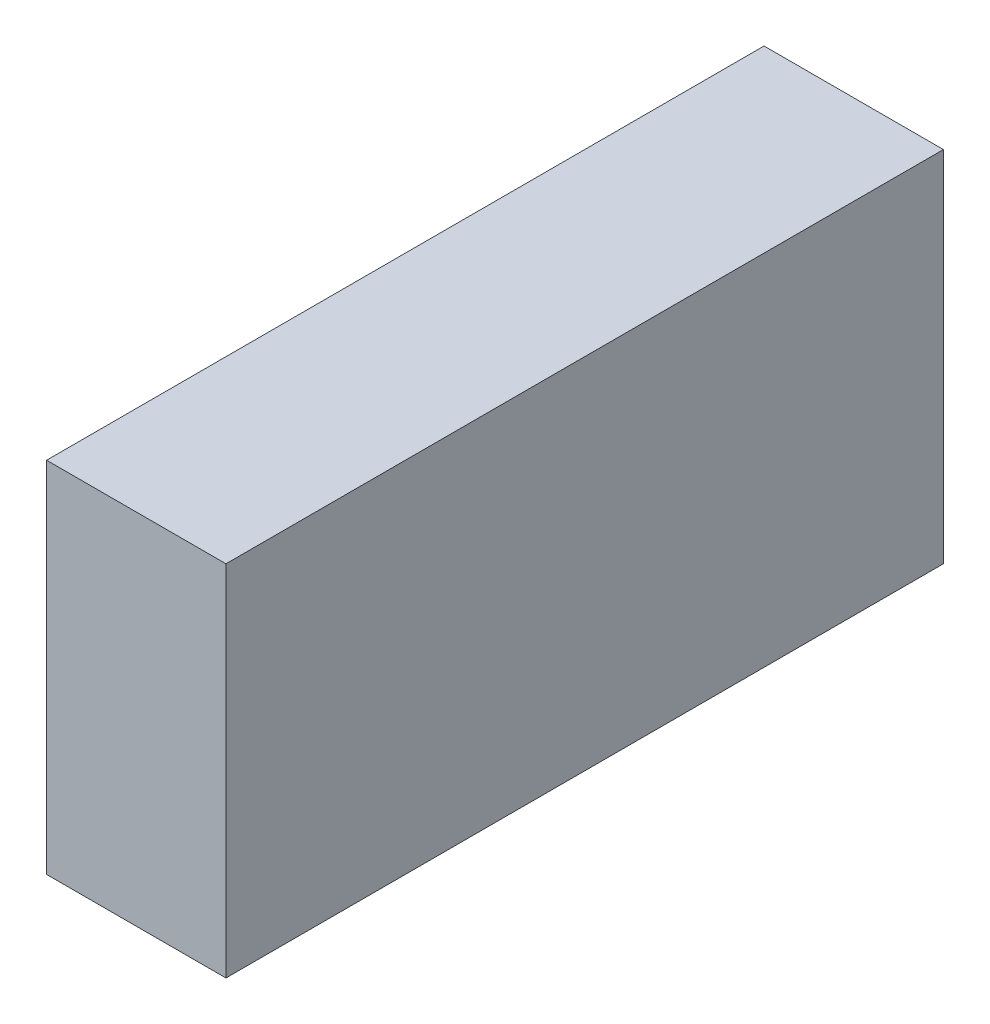
ISO-10303-21;
HEADER;
FILE_DESCRIPTION(('STEP AP214'),'2;1');
FILE_NAME('part.step','',(''),(''),'','','');
FILE_SCHEMA(('AUTOMOTIVE_DESIGN { 1 0 10303 214 1 1 1 1 }'));
ENDSEC;
DATA;
#1=APPLICATION_CONTEXT('core data for automotive mechanical design processes');
#2=APPLICATION_PROTOCOL_DEFINITION('international standard','automotive_design',2000,#1);
#3=PRODUCT_CONTEXT('',#1,'mechanical');
#4=PRODUCT('Part','Part','',(#3));
#5=PRODUCT_RELATED_PRODUCT_CATEGORY('part','',(#4));
#6=PRODUCT_DEFINITION_FORMATION('','',#4);
#7=PRODUCT_DEFINITION_CONTEXT('part definition',#1,'design');
#8=PRODUCT_DEFINITION('design','',#6,#7);
#9=PRODUCT_DEFINITION_SHAPE('','',#8);
#10=(LENGTH_UNIT() NAMED_UNIT(*) SI_UNIT(.MILLI.,.METRE.));
#11=(NAMED_UNIT(*) PLANE_ANGLE_UNIT() SI_UNIT($,.RADIAN.));
#12=(NAMED_UNIT(*) SI_UNIT($,.STERADIAN.) SOLID_ANGLE_UNIT());
#13=UNCERTAINTY_MEASURE_WITH_UNIT(LENGTH_MEASURE(1.E-05),#10,'distance_accuracy_value','');
#14=(GEOMETRIC_REPRESENTATION_CONTEXT(3) GLOBAL_UNCERTAINTY_ASSIGNED_CONTEXT((#13)) GLOBAL_UNIT_ASSIGNED_CONTEXT((#10,
#11,#12)) REPRESENTATION_CONTEXT('',''));
#15=CARTESIAN_POINT('',(0.,0.,0.));
#16=DIRECTION('',(0.,0.,1.));
#17=DIRECTION('',(1.,0.,0.));
#18=AXIS2_PLACEMENT_3D('',#15,#16,#17);
#19=CARTESIAN_POINT('',(10.,20.,0.));
#20=DIRECTION('',(0.,0.,-1.));
#21=DIRECTION('',(-1.,0.,0.));
#22=AXIS2_PLACEMENT_3D('',#19,#20,#21);
#23=PLANE('',#22);
#24=DIRECTION('',(0.,-1.,0.));
#25=VECTOR('',#24,1.);
#26=CARTESIAN_POINT('',(0.,20.,0.));
#27=LINE('',#26,#25);
#28=CARTESIAN_POINT('',(0.,20.,0.));
#29=VERTEX_POINT('',#28);
#30=CARTESIAN_POINT('',(0.,0.,0.));
#31=VERTEX_POINT('',#30);
#32=EDGE_CURVE('E104',#29,#31,#27,.T.);
#33=ORIENTED_EDGE('',*,*,#32,.T.);
#34=DIRECTION('',(-1.,0.,0.));
#35=VECTOR('',#34,1.);
#36=CARTESIAN_POINT('',(10.,0.,0.));
#37=LINE('',#36,#35);
#38=CARTESIAN_POINT('',(10.,0.,0.));
#39=VERTEX_POINT('',#38);
#40=EDGE_CURVE('E11',#39,#31,#37,.T.);
#41=ORIENTED_EDGE('',*,*,#40,.F.);
#42=DIRECTION('',(0.,-1.,0.));
#43=VECTOR('',#42,1.);
#44=CARTESIAN_POINT('',(10.,20.,0.));
#45=LINE('',#44,#43);
#46=CARTESIAN_POINT('',(10.,20.,0.));
#47=VERTEX_POINT('',#46);
#48=EDGE_CURVE('E92',#47,#39,#45,.T.);
#49=ORIENTED_EDGE('',*,*,#48,.F.);
#50=DIRECTION('',(-1.,0.,0.));
#51=VECTOR('',#50,1.);
#52=CARTESIAN_POINT('',(10.,20.,0.));
#53=LINE('',#52,#51);
#54=EDGE_CURVE('E100',#47,#29,#53,.T.);
#55=ORIENTED_EDGE('',*,*,#54,.T.);
#56=EDGE_LOOP('',(#33,#41,#49,#55));
#57=FACE_BOUND('',#56,.T.);
#58=ADVANCED_FACE('F41',(#57),#23,.F.);
#59=CARTESIAN_POINT('',(10.,0.,0.));
#60=DIRECTION('',(0.,1.,0.));
#61=DIRECTION('',(0.,0.,1.));
#62=AXIS2_PLACEMENT_3D('',#59,#60,#61);
#63=PLANE('',#62);
#64=DIRECTION('',(0.,0.,-1.));
#65=VECTOR('',#64,1.);
#66=CARTESIAN_POINT('',(0.,0.,0.));
#67=LINE('',#66,#65);
#68=CARTESIAN_POINT('',(0.,0.,-40.));
#69=VERTEX_POINT('',#68);
#70=EDGE_CURVE('E96',#31,#69,#67,.T.);
#71=ORIENTED_EDGE('',*,*,#70,.T.);
#72=DIRECTION('',(-1.,0.,0.));
#73=VECTOR('',#72,1.);
#74=CARTESIAN_POINT('',(10.,0.,-40.));
#75=LINE('',#74,#73);
#76=CARTESIAN_POINT('',(10.,0.,-40.));
#77=VERTEX_POINT('',#76);
#78=EDGE_CURVE('E49',#77,#69,#75,.T.);
#79=ORIENTED_EDGE('',*,*,#78,.F.);
#80=DIRECTION('',(0.,0.,-1.));
#81=VECTOR('',#80,1.);
#82=CARTESIAN_POINT('',(10.,0.,0.));
#83=LINE('',#82,#81);
#84=EDGE_CURVE('E87',#39,#77,#83,.T.);
#85=ORIENTED_EDGE('',*,*,#84,.F.);
#86=ORIENTED_EDGE('',*,*,#40,.T.);
#87=EDGE_LOOP('',(#71,#79,#85,#86));
#88=FACE_BOUND('',#87,.T.);
#89=ADVANCED_FACE('F95',(#88),#63,.F.);
#90=CARTESIAN_POINT('',(10.,0.,-40.));
#91=DIRECTION('',(0.,0.,1.));
#92=DIRECTION('',(1.,0.,0.));
#93=AXIS2_PLACEMENT_3D('',#90,#91,#92);
#94=PLANE('',#93);
#95=DIRECTION('',(0.,1.,0.));
#96=VECTOR('',#95,1.);
#97=CARTESIAN_POINT('',(0.,0.,-40.));
#98=LINE('',#97,#96);
#99=CARTESIAN_POINT('',(0.,20.,-40.));
#100=VERTEX_POINT('',#99);
#101=EDGE_CURVE('E74',#69,#100,#98,.T.);
#102=ORIENTED_EDGE('',*,*,#101,.T.);
#103=DIRECTION('',(-1.,0.,0.));
#104=VECTOR('',#103,1.);
#105=CARTESIAN_POINT('',(10.,20.,-40.));
#106=LINE('',#105,#104);
#107=CARTESIAN_POINT('',(10.,20.,-40.));
#108=VERTEX_POINT('',#107);
#109=EDGE_CURVE('E97',#108,#100,#106,.T.);
#110=ORIENTED_EDGE('',*,*,#109,.F.);
#111=DIRECTION('',(0.,1.,0.));
#112=VECTOR('',#111,1.);
#113=CARTESIAN_POINT('',(10.,0.,-40.));
#114=LINE('',#113,#112);
#115=EDGE_CURVE('E90',#77,#108,#114,.T.);
#116=ORIENTED_EDGE('',*,*,#115,.F.);
#117=ORIENTED_EDGE('',*,*,#78,.T.);
#118=EDGE_LOOP('',(#102,#110,#116,#117));
#119=FACE_BOUND('',#118,.T.);
#120=ADVANCED_FACE('F98',(#119),#94,.F.);
#121=CARTESIAN_POINT('',(10.,20.,-40.));
#122=DIRECTION('',(0.,-1.,0.));
#123=DIRECTION('',(0.,0.,-1.));
#124=AXIS2_PLACEMENT_3D('',#121,#122,#123);
#125=PLANE('',#124);
#126=DIRECTION('',(0.,0.,1.));
#127=VECTOR('',#126,1.);
#128=CARTESIAN_POINT('',(0.,20.,-40.));
#129=LINE('',#128,#127);
#130=EDGE_CURVE('E80',#100,#29,#129,.T.);
#131=ORIENTED_EDGE('',*,*,#130,.T.);
#132=ORIENTED_EDGE('',*,*,#54,.F.);
#133=DIRECTION('',(0.,0.,1.));
#134=VECTOR('',#133,1.);
#135=CARTESIAN_POINT('',(10.,20.,-40.));
#136=LINE('',#135,#134);
#137=EDGE_CURVE('E57',#108,#47,#136,.T.);
#138=ORIENTED_EDGE('',*,*,#137,.F.);
#139=ORIENTED_EDGE('',*,*,#109,.T.);
#140=EDGE_LOOP('',(#131,#132,#138,#139));
#141=FACE_BOUND('',#140,.T.);
#142=ADVANCED_FACE('F111',(#141),#125,.F.);
#143=CARTESIAN_POINT('',(10.,0.,0.));
#144=DIRECTION('',(1.,0.,0.));
#145=DIRECTION('',(0.,0.,-1.));
#146=AXIS2_PLACEMENT_3D('',#143,#144,#145);
#147=PLANE('',#146);
#148=ORIENTED_EDGE('',*,*,#48,.T.);
#149=ORIENTED_EDGE('',*,*,#84,.T.);
#150=ORIENTED_EDGE('',*,*,#115,.T.);
#151=ORIENTED_EDGE('',*,*,#137,.T.);
#152=EDGE_LOOP('',(#148,#149,#150,#151));
#153=FACE_BOUND('',#152,.T.);
#154=ADVANCED_FACE('F88',(#153),#147,.T.);
#155=CARTESIAN_POINT('',(0.,0.,0.));
#156=DIRECTION('',(1.,0.,0.));
#157=DIRECTION('',(0.,0.,-1.));
#158=AXIS2_PLACEMENT_3D('',#155,#156,#157);
#159=PLANE('',#158);
#160=ORIENTED_EDGE('',*,*,#32,.F.);
#161=ORIENTED_EDGE('',*,*,#130,.F.);
#162=ORIENTED_EDGE('',*,*,#101,.F.);
#163=ORIENTED_EDGE('',*,*,#70,.F.);
#164=EDGE_LOOP('',(#160,#161,#162,#163));
#165=FACE_BOUND('',#164,.T.);
#166=ADVANCED_FACE('F114',(#165),#159,.F.);
#167=CLOSED_SHELL('',(#58,#89,#120,#142,#154,#166));
#168=MANIFOLD_SOLID_BREP('B2',#167);
#169=ADVANCED_BREP_SHAPE_REPRESENTATION('',(#18,#168),#14);
#170=SHAPE_DEFINITION_REPRESENTATION(#9,#169);
ENDSEC;
END-ISO-10303-21;
